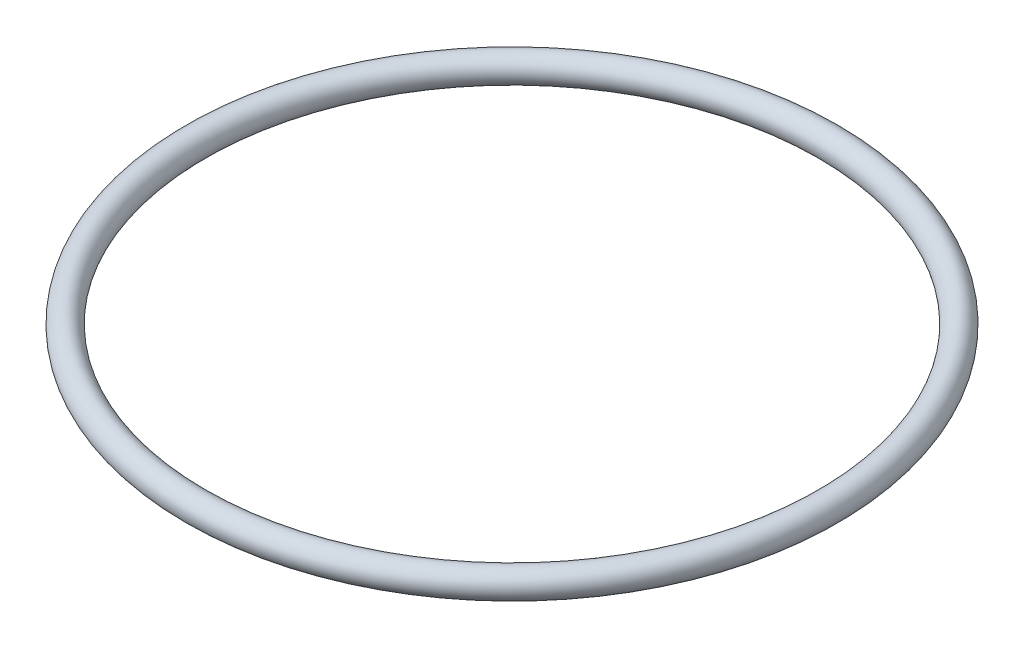
ISO-10303-21;
HEADER;
FILE_DESCRIPTION(('STEP AP214'),'2;1');
FILE_NAME('part.step','',(''),(''),'','','');
FILE_SCHEMA(('AUTOMOTIVE_DESIGN { 1 0 10303 214 1 1 1 1 }'));
ENDSEC;
DATA;
#1=APPLICATION_CONTEXT('core data for automotive mechanical design processes');
#2=APPLICATION_PROTOCOL_DEFINITION('international standard','automotive_design',2000,#1);
#3=PRODUCT_CONTEXT('',#1,'mechanical');
#4=PRODUCT('Part','Part','',(#3));
#5=PRODUCT_RELATED_PRODUCT_CATEGORY('part','',(#4));
#6=PRODUCT_DEFINITION_FORMATION('','',#4);
#7=PRODUCT_DEFINITION_CONTEXT('part definition',#1,'design');
#8=PRODUCT_DEFINITION('design','',#6,#7);
#9=PRODUCT_DEFINITION_SHAPE('','',#8);
#10=(LENGTH_UNIT() NAMED_UNIT(*) SI_UNIT(.MILLI.,.METRE.));
#11=(NAMED_UNIT(*) PLANE_ANGLE_UNIT() SI_UNIT($,.RADIAN.));
#12=(NAMED_UNIT(*) SI_UNIT($,.STERADIAN.) SOLID_ANGLE_UNIT());
#13=UNCERTAINTY_MEASURE_WITH_UNIT(LENGTH_MEASURE(1.E-05),#10,'distance_accuracy_value','');
#14=(GEOMETRIC_REPRESENTATION_CONTEXT(3) GLOBAL_UNCERTAINTY_ASSIGNED_CONTEXT((#13)) GLOBAL_UNIT_ASSIGNED_CONTEXT((#10,
#11,#12)) REPRESENTATION_CONTEXT('',''));
#15=CARTESIAN_POINT('',(0.,0.,0.));
#16=DIRECTION('',(0.,0.,1.));
#17=DIRECTION('',(1.,0.,0.));
#18=AXIS2_PLACEMENT_3D('',#15,#16,#17);
#19=CARTESIAN_POINT('',(0.,0.,0.));
#20=DIRECTION('',(0.,-1.,0.));
#21=DIRECTION('',(0.,0.,-1.));
#22=AXIS2_PLACEMENT_3D('',#19,#20,#21);
#23=TOROIDAL_SURFACE('',#22,30.5181,1.30810000000001);
#24=CARTESIAN_POINT('',(0.,0.,-31.8262));
#25=VERTEX_POINT('',#24);
#26=VERTEX_LOOP('',#25);
#27=FACE_BOUND('',#26,.T.);
#28=ADVANCED_FACE('F30',(#27),#23,.T.);
#29=CLOSED_SHELL('',(#28));
#30=MANIFOLD_SOLID_BREP('B2',#29);
#31=ADVANCED_BREP_SHAPE_REPRESENTATION('',(#18,#30),#14);
#32=SHAPE_DEFINITION_REPRESENTATION(#9,#31);
ENDSEC;
END-ISO-10303-21;
